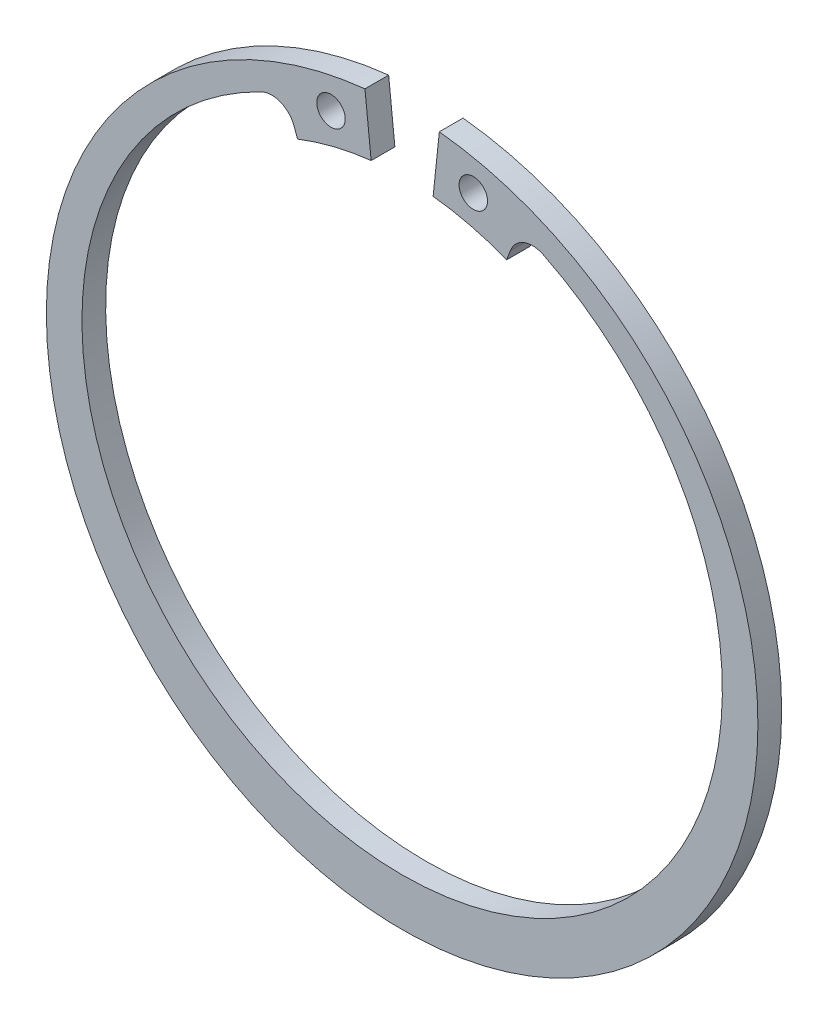
ISO-10303-21;
HEADER;
FILE_DESCRIPTION(('STEP AP214'),'2;1');
FILE_NAME('part.step','',(''),(''),'','','');
FILE_SCHEMA(('AUTOMOTIVE_DESIGN { 1 0 10303 214 1 1 1 1 }'));
ENDSEC;
DATA;
#1=APPLICATION_CONTEXT('core data for automotive mechanical design processes');
#2=APPLICATION_PROTOCOL_DEFINITION('international standard','automotive_design',2000,#1);
#3=PRODUCT_CONTEXT('',#1,'mechanical');
#4=PRODUCT('Part','Part','',(#3));
#5=PRODUCT_RELATED_PRODUCT_CATEGORY('part','',(#4));
#6=PRODUCT_DEFINITION_FORMATION('','',#4);
#7=PRODUCT_DEFINITION_CONTEXT('part definition',#1,'design');
#8=PRODUCT_DEFINITION('design','',#6,#7);
#9=PRODUCT_DEFINITION_SHAPE('','',#8);
#10=(LENGTH_UNIT() NAMED_UNIT(*) SI_UNIT(.MILLI.,.METRE.));
#11=(NAMED_UNIT(*) PLANE_ANGLE_UNIT() SI_UNIT($,.RADIAN.));
#12=(NAMED_UNIT(*) SI_UNIT($,.STERADIAN.) SOLID_ANGLE_UNIT());
#13=UNCERTAINTY_MEASURE_WITH_UNIT(LENGTH_MEASURE(1.E-05),#10,'distance_accuracy_value','');
#14=(GEOMETRIC_REPRESENTATION_CONTEXT(3) GLOBAL_UNCERTAINTY_ASSIGNED_CONTEXT((#13)) GLOBAL_UNIT_ASSIGNED_CONTEXT((#10,
#11,#12)) REPRESENTATION_CONTEXT('',''));
#15=CARTESIAN_POINT('',(0.,0.,0.));
#16=DIRECTION('',(0.,0.,1.));
#17=DIRECTION('',(1.,0.,0.));
#18=AXIS2_PLACEMENT_3D('',#15,#16,#17);
#19=CARTESIAN_POINT('',(-5.5,11.7249721603218,1.));
#20=DIRECTION('',(0.,0.,-1.));
#21=DIRECTION('',(-1.,0.,0.));
#22=AXIS2_PLACEMENT_3D('',#19,#20,#21);
#23=PLANE('',#22);
#24=CARTESIAN_POINT('',(-3.,13.4,1.));
#25=DIRECTION('',(0.,0.,1.));
#26=DIRECTION('',(1.,0.,0.));
#27=AXIS2_PLACEMENT_3D('',#24,#25,#26);
#28=CIRCLE('',#27,0.6);
#29=CARTESIAN_POINT('',(-2.4,13.4,1.));
#30=VERTEX_POINT('',#29);
#31=EDGE_CURVE('E444',#30,#30,#28,.T.);
#32=ORIENTED_EDGE('',*,*,#31,.F.);
#33=EDGE_LOOP('',(#32));
#34=FACE_BOUND('',#33,.T.);
#35=CARTESIAN_POINT('',(-5.5,11.7249721603218,1.));
#36=DIRECTION('',(0.,0.,-1.));
#37=DIRECTION('',(-1.,0.,0.));
#38=AXIS2_PLACEMENT_3D('',#35,#36,#37);
#39=CIRCLE('',#38,0.999999999999999);
#40=CARTESIAN_POINT('',(-5.94,12.6229699331476,1.));
#41=VERTEX_POINT('',#40);
#42=CARTESIAN_POINT('',(-4.56456854780298,12.0784802906959,1.));
#43=VERTEX_POINT('',#42);
#44=EDGE_CURVE('E466',#41,#43,#39,.T.);
#45=ORIENTED_EDGE('',*,*,#44,.T.);
#46=DIRECTION('',(0.353508130374086,-0.935431452197016,0.));
#47=VECTOR('',#46,1.);
#48=CARTESIAN_POINT('',(-4.40697867220381,11.6614756633136,1.));
#49=LINE('',#48,#47);
#50=CARTESIAN_POINT('',(-4.40697867220381,11.6614756633136,1.));
#51=VERTEX_POINT('',#50);
#52=EDGE_CURVE('E439',#43,#51,#49,.T.);
#53=ORIENTED_EDGE('',*,*,#52,.T.);
#54=CARTESIAN_POINT('',(0.,0.5,1.));
#55=DIRECTION('',(0.,0.,-1.));
#56=DIRECTION('',(1.,0.,0.));
#57=AXIS2_PLACEMENT_3D('',#54,#55,#56);
#58=CIRCLE('',#57,12.);
#59=CARTESIAN_POINT('',(-1.30630758499678,12.4286864529746,1.));
#60=VERTEX_POINT('',#59);
#61=EDGE_CURVE('E469',#51,#60,#58,.T.);
#62=ORIENTED_EDGE('',*,*,#61,.T.);
#63=DIRECTION('',(-0.104528463267654,0.994521895368273,0.));
#64=VECTOR('',#63,1.);
#65=CARTESIAN_POINT('',(-1.30630758499678,12.4286864529746,1.));
#66=LINE('',#65,#64);
#67=CARTESIAN_POINT('',(-1.56792694901482,14.9178284305241,1.));
#68=VERTEX_POINT('',#67);
#69=EDGE_CURVE('E471',#60,#68,#66,.T.);
#70=ORIENTED_EDGE('',*,*,#69,.T.);
#71=CARTESIAN_POINT('',(0.,0.,1.));
#72=DIRECTION('',(0.,0.,1.));
#73=DIRECTION('',(1.,0.,0.));
#74=AXIS2_PLACEMENT_3D('',#71,#72,#73);
#75=CIRCLE('',#74,15.);
#76=CARTESIAN_POINT('',(1.56792694901482,14.9178284305241,1.));
#77=VERTEX_POINT('',#76);
#78=EDGE_CURVE('E473',#68,#77,#75,.T.);
#79=ORIENTED_EDGE('',*,*,#78,.T.);
#80=DIRECTION('',(-0.104528463267654,-0.994521895368273,0.));
#81=VECTOR('',#80,1.);
#82=CARTESIAN_POINT('',(1.30630758499678,12.4286864529746,1.));
#83=LINE('',#82,#81);
#84=CARTESIAN_POINT('',(1.30630758499678,12.4286864529746,1.));
#85=VERTEX_POINT('',#84);
#86=EDGE_CURVE('E475',#77,#85,#83,.T.);
#87=ORIENTED_EDGE('',*,*,#86,.T.);
#88=CARTESIAN_POINT('',(0.,0.5,1.));
#89=DIRECTION('',(0.,0.,-1.));
#90=DIRECTION('',(-1.,0.,0.));
#91=AXIS2_PLACEMENT_3D('',#88,#89,#90);
#92=CIRCLE('',#91,12.);
#93=CARTESIAN_POINT('',(4.40697867220381,11.6614756633136,1.));
#94=VERTEX_POINT('',#93);
#95=EDGE_CURVE('E477',#85,#94,#92,.T.);
#96=ORIENTED_EDGE('',*,*,#95,.T.);
#97=DIRECTION('',(0.353508130374086,0.935431452197016,0.));
#98=VECTOR('',#97,1.);
#99=CARTESIAN_POINT('',(4.40697867220381,11.6614756633136,1.));
#100=LINE('',#99,#98);
#101=CARTESIAN_POINT('',(4.56456854780298,12.0784802906959,1.));
#102=VERTEX_POINT('',#101);
#103=EDGE_CURVE('E479',#94,#102,#100,.T.);
#104=ORIENTED_EDGE('',*,*,#103,.T.);
#105=CARTESIAN_POINT('',(5.5,11.7249721603218,1.));
#106=DIRECTION('',(0.,0.,-1.));
#107=DIRECTION('',(1.,0.,0.));
#108=AXIS2_PLACEMENT_3D('',#105,#106,#107);
#109=CIRCLE('',#108,1.);
#110=CARTESIAN_POINT('',(5.93999999999999,12.6229699331476,1.));
#111=VERTEX_POINT('',#110);
#112=EDGE_CURVE('E368',#102,#111,#109,.T.);
#113=ORIENTED_EDGE('',*,*,#112,.T.);
#114=CARTESIAN_POINT('',(0.,0.5,1.));
#115=DIRECTION('',(0.,0.,-1.));
#116=DIRECTION('',(1.,0.,0.));
#117=AXIS2_PLACEMENT_3D('',#114,#115,#116);
#118=CIRCLE('',#117,13.5);
#119=EDGE_CURVE('E363',#111,#41,#118,.T.);
#120=ORIENTED_EDGE('',*,*,#119,.T.);
#121=EDGE_LOOP('',(#45,#53,#62,#70,#79,#87,#96,#104,#113,#120));
#122=FACE_BOUND('',#121,.T.);
#123=CARTESIAN_POINT('',(3.,13.4,1.));
#124=DIRECTION('',(0.,0.,1.));
#125=DIRECTION('',(-1.,0.,0.));
#126=AXIS2_PLACEMENT_3D('',#123,#124,#125);
#127=CIRCLE('',#126,0.6);
#128=CARTESIAN_POINT('',(2.4,13.4,1.));
#129=VERTEX_POINT('',#128);
#130=EDGE_CURVE('E566',#129,#129,#127,.T.);
#131=ORIENTED_EDGE('',*,*,#130,.F.);
#132=EDGE_LOOP('',(#131));
#133=FACE_BOUND('',#132,.T.);
#134=ADVANCED_FACE('F348',(#34,#122,#133),#23,.F.);
#135=CARTESIAN_POINT('',(-5.5,11.7249721603218,0.));
#136=DIRECTION('',(0.,0.,-1.));
#137=DIRECTION('',(-1.,0.,0.));
#138=AXIS2_PLACEMENT_3D('',#135,#136,#137);
#139=PLANE('',#138);
#140=CARTESIAN_POINT('',(-3.,13.4,0.));
#141=DIRECTION('',(0.,0.,1.));
#142=DIRECTION('',(1.,0.,0.));
#143=AXIS2_PLACEMENT_3D('',#140,#141,#142);
#144=CIRCLE('',#143,0.6);
#145=CARTESIAN_POINT('',(-2.4,13.4,0.));
#146=VERTEX_POINT('',#145);
#147=EDGE_CURVE('E447',#146,#146,#144,.T.);
#148=ORIENTED_EDGE('',*,*,#147,.T.);
#149=EDGE_LOOP('',(#148));
#150=FACE_BOUND('',#149,.T.);
#151=CARTESIAN_POINT('',(-5.5,11.7249721603218,0.));
#152=DIRECTION('',(0.,0.,-1.));
#153=DIRECTION('',(-1.,0.,0.));
#154=AXIS2_PLACEMENT_3D('',#151,#152,#153);
#155=CIRCLE('',#154,0.999999999999999);
#156=CARTESIAN_POINT('',(-5.94,12.6229699331476,0.));
#157=VERTEX_POINT('',#156);
#158=CARTESIAN_POINT('',(-4.56456854780298,12.0784802906959,0.));
#159=VERTEX_POINT('',#158);
#160=EDGE_CURVE('E430',#157,#159,#155,.T.);
#161=ORIENTED_EDGE('',*,*,#160,.F.);
#162=CARTESIAN_POINT('',(0.,0.5,0.));
#163=DIRECTION('',(0.,0.,-1.));
#164=DIRECTION('',(1.,0.,0.));
#165=AXIS2_PLACEMENT_3D('',#162,#163,#164);
#166=CIRCLE('',#165,13.5);
#167=CARTESIAN_POINT('',(5.93999999999999,12.6229699331476,0.));
#168=VERTEX_POINT('',#167);
#169=EDGE_CURVE('E464',#168,#157,#166,.T.);
#170=ORIENTED_EDGE('',*,*,#169,.F.);
#171=CARTESIAN_POINT('',(5.5,11.7249721603218,0.));
#172=DIRECTION('',(0.,0.,-1.));
#173=DIRECTION('',(1.,0.,0.));
#174=AXIS2_PLACEMENT_3D('',#171,#172,#173);
#175=CIRCLE('',#174,1.);
#176=CARTESIAN_POINT('',(4.56456854780298,12.0784802906959,0.));
#177=VERTEX_POINT('',#176);
#178=EDGE_CURVE('E462',#177,#168,#175,.T.);
#179=ORIENTED_EDGE('',*,*,#178,.F.);
#180=DIRECTION('',(0.353508130374086,0.935431452197016,0.));
#181=VECTOR('',#180,1.);
#182=CARTESIAN_POINT('',(4.40697867220381,11.6614756633136,0.));
#183=LINE('',#182,#181);
#184=CARTESIAN_POINT('',(4.40697867220381,11.6614756633136,0.));
#185=VERTEX_POINT('',#184);
#186=EDGE_CURVE('E460',#185,#177,#183,.T.);
#187=ORIENTED_EDGE('',*,*,#186,.F.);
#188=CARTESIAN_POINT('',(0.,0.5,0.));
#189=DIRECTION('',(0.,0.,-1.));
#190=DIRECTION('',(-1.,0.,0.));
#191=AXIS2_PLACEMENT_3D('',#188,#189,#190);
#192=CIRCLE('',#191,12.);
#193=CARTESIAN_POINT('',(1.30630758499678,12.4286864529746,0.));
#194=VERTEX_POINT('',#193);
#195=EDGE_CURVE('E458',#194,#185,#192,.T.);
#196=ORIENTED_EDGE('',*,*,#195,.F.);
#197=DIRECTION('',(-0.104528463267654,-0.994521895368273,0.));
#198=VECTOR('',#197,1.);
#199=CARTESIAN_POINT('',(1.30630758499678,12.4286864529746,0.));
#200=LINE('',#199,#198);
#201=CARTESIAN_POINT('',(1.56792694901482,14.9178284305241,0.));
#202=VERTEX_POINT('',#201);
#203=EDGE_CURVE('E456',#202,#194,#200,.T.);
#204=ORIENTED_EDGE('',*,*,#203,.F.);
#205=CARTESIAN_POINT('',(0.,0.,0.));
#206=DIRECTION('',(0.,0.,1.));
#207=DIRECTION('',(1.,0.,0.));
#208=AXIS2_PLACEMENT_3D('',#205,#206,#207);
#209=CIRCLE('',#208,15.);
#210=CARTESIAN_POINT('',(-1.56792694901482,14.9178284305241,0.));
#211=VERTEX_POINT('',#210);
#212=EDGE_CURVE('E454',#211,#202,#209,.T.);
#213=ORIENTED_EDGE('',*,*,#212,.F.);
#214=DIRECTION('',(-0.104528463267654,0.994521895368273,0.));
#215=VECTOR('',#214,1.);
#216=CARTESIAN_POINT('',(-1.30630758499678,12.4286864529746,0.));
#217=LINE('',#216,#215);
#218=CARTESIAN_POINT('',(-1.30630758499678,12.4286864529746,0.));
#219=VERTEX_POINT('',#218);
#220=EDGE_CURVE('E452',#219,#211,#217,.T.);
#221=ORIENTED_EDGE('',*,*,#220,.F.);
#222=CARTESIAN_POINT('',(0.,0.5,0.));
#223=DIRECTION('',(0.,0.,-1.));
#224=DIRECTION('',(1.,0.,0.));
#225=AXIS2_PLACEMENT_3D('',#222,#223,#224);
#226=CIRCLE('',#225,12.);
#227=CARTESIAN_POINT('',(-4.40697867220381,11.6614756633136,0.));
#228=VERTEX_POINT('',#227);
#229=EDGE_CURVE('E432',#228,#219,#226,.T.);
#230=ORIENTED_EDGE('',*,*,#229,.F.);
#231=DIRECTION('',(0.353508130374086,-0.935431452197016,0.));
#232=VECTOR('',#231,1.);
#233=CARTESIAN_POINT('',(-4.40697867220381,11.6614756633136,0.));
#234=LINE('',#233,#232);
#235=EDGE_CURVE('E425',#159,#228,#234,.T.);
#236=ORIENTED_EDGE('',*,*,#235,.F.);
#237=EDGE_LOOP('',(#161,#170,#179,#187,#196,#204,#213,#221,#230,#236));
#238=FACE_BOUND('',#237,.T.);
#239=CARTESIAN_POINT('',(3.,13.4,0.));
#240=DIRECTION('',(0.,0.,1.));
#241=DIRECTION('',(-1.,0.,0.));
#242=AXIS2_PLACEMENT_3D('',#239,#240,#241);
#243=CIRCLE('',#242,0.6);
#244=CARTESIAN_POINT('',(2.4,13.4,0.));
#245=VERTEX_POINT('',#244);
#246=EDGE_CURVE('E569',#245,#245,#243,.T.);
#247=ORIENTED_EDGE('',*,*,#246,.T.);
#248=EDGE_LOOP('',(#247));
#249=FACE_BOUND('',#248,.T.);
#250=ADVANCED_FACE('F426',(#150,#238,#249),#139,.T.);
#251=CARTESIAN_POINT('',(-5.5,11.7249721603218,1.));
#252=DIRECTION('',(0.,0.,-1.));
#253=DIRECTION('',(-1.,0.,0.));
#254=AXIS2_PLACEMENT_3D('',#251,#252,#253);
#255=CYLINDRICAL_SURFACE('',#254,0.999999999999999);
#256=ORIENTED_EDGE('',*,*,#160,.T.);
#257=DIRECTION('',(0.,0.,-1.));
#258=VECTOR('',#257,1.);
#259=CARTESIAN_POINT('',(-4.56456854780298,12.0784802906959,1.));
#260=LINE('',#259,#258);
#261=EDGE_CURVE('E11',#43,#159,#260,.T.);
#262=ORIENTED_EDGE('',*,*,#261,.F.);
#263=ORIENTED_EDGE('',*,*,#44,.F.);
#264=DIRECTION('',(0.,0.,-1.));
#265=VECTOR('',#264,1.);
#266=CARTESIAN_POINT('',(-5.94,12.6229699331476,1.));
#267=LINE('',#266,#265);
#268=EDGE_CURVE('E443',#41,#157,#267,.T.);
#269=ORIENTED_EDGE('',*,*,#268,.T.);
#270=EDGE_LOOP('',(#256,#262,#263,#269));
#271=FACE_BOUND('',#270,.T.);
#272=ADVANCED_FACE('F350',(#271),#255,.F.);
#273=CARTESIAN_POINT('',(-4.40697867220381,11.6614756633136,1.));
#274=DIRECTION('',(0.935431452197016,0.353508130374086,0.));
#275=DIRECTION('',(-0.353508130374086,0.935431452197016,0.));
#276=AXIS2_PLACEMENT_3D('',#273,#274,#275);
#277=PLANE('',#276);
#278=ORIENTED_EDGE('',*,*,#235,.T.);
#279=DIRECTION('',(0.,0.,-1.));
#280=VECTOR('',#279,1.);
#281=CARTESIAN_POINT('',(-4.40697867220381,11.6614756633136,1.));
#282=LINE('',#281,#280);
#283=EDGE_CURVE('E356',#51,#228,#282,.T.);
#284=ORIENTED_EDGE('',*,*,#283,.F.);
#285=ORIENTED_EDGE('',*,*,#52,.F.);
#286=ORIENTED_EDGE('',*,*,#261,.T.);
#287=EDGE_LOOP('',(#278,#284,#285,#286));
#288=FACE_BOUND('',#287,.T.);
#289=ADVANCED_FACE('F438',(#288),#277,.F.);
#290=CARTESIAN_POINT('',(0.,0.5,1.));
#291=DIRECTION('',(0.,0.,-1.));
#292=DIRECTION('',(-1.,0.,0.));
#293=AXIS2_PLACEMENT_3D('',#290,#291,#292);
#294=CYLINDRICAL_SURFACE('',#293,12.);
#295=ORIENTED_EDGE('',*,*,#229,.T.);
#296=DIRECTION('',(0.,0.,-1.));
#297=VECTOR('',#296,1.);
#298=CARTESIAN_POINT('',(-1.30630758499678,12.4286864529746,1.));
#299=LINE('',#298,#297);
#300=EDGE_CURVE('E502',#60,#219,#299,.T.);
#301=ORIENTED_EDGE('',*,*,#300,.F.);
#302=ORIENTED_EDGE('',*,*,#61,.F.);
#303=ORIENTED_EDGE('',*,*,#283,.T.);
#304=EDGE_LOOP('',(#295,#301,#302,#303));
#305=FACE_BOUND('',#304,.T.);
#306=ADVANCED_FACE('F506',(#305),#294,.F.);
#307=CARTESIAN_POINT('',(-1.30630758499678,12.4286864529746,1.));
#308=DIRECTION('',(-0.994521895368273,-0.104528463267654,0.));
#309=DIRECTION('',(0.104528463267654,-0.994521895368273,0.));
#310=AXIS2_PLACEMENT_3D('',#307,#308,#309);
#311=PLANE('',#310);
#312=ORIENTED_EDGE('',*,*,#220,.T.);
#313=DIRECTION('',(0.,0.,-1.));
#314=VECTOR('',#313,1.);
#315=CARTESIAN_POINT('',(-1.56792694901482,14.9178284305241,1.));
#316=LINE('',#315,#314);
#317=EDGE_CURVE('E499',#68,#211,#316,.T.);
#318=ORIENTED_EDGE('',*,*,#317,.F.);
#319=ORIENTED_EDGE('',*,*,#69,.F.);
#320=ORIENTED_EDGE('',*,*,#300,.T.);
#321=EDGE_LOOP('',(#312,#318,#319,#320));
#322=FACE_BOUND('',#321,.T.);
#323=ADVANCED_FACE('F514',(#322),#311,.F.);
#324=CARTESIAN_POINT('',(0.,0.,1.));
#325=DIRECTION('',(0.,0.,-1.));
#326=DIRECTION('',(-1.,0.,0.));
#327=AXIS2_PLACEMENT_3D('',#324,#325,#326);
#328=CYLINDRICAL_SURFACE('',#327,15.);
#329=ORIENTED_EDGE('',*,*,#212,.T.);
#330=DIRECTION('',(0.,0.,-1.));
#331=VECTOR('',#330,1.);
#332=CARTESIAN_POINT('',(1.56792694901482,14.9178284305241,1.));
#333=LINE('',#332,#331);
#334=EDGE_CURVE('E496',#77,#202,#333,.T.);
#335=ORIENTED_EDGE('',*,*,#334,.F.);
#336=ORIENTED_EDGE('',*,*,#78,.F.);
#337=ORIENTED_EDGE('',*,*,#317,.T.);
#338=EDGE_LOOP('',(#329,#335,#336,#337));
#339=FACE_BOUND('',#338,.T.);
#340=ADVANCED_FACE('F517',(#339),#328,.T.);
#341=CARTESIAN_POINT('',(1.30630758499678,12.4286864529746,1.));
#342=DIRECTION('',(0.994521895368273,-0.104528463267654,0.));
#343=DIRECTION('',(0.104528463267654,0.994521895368273,0.));
#344=AXIS2_PLACEMENT_3D('',#341,#342,#343);
#345=PLANE('',#344);
#346=ORIENTED_EDGE('',*,*,#203,.T.);
#347=DIRECTION('',(0.,0.,-1.));
#348=VECTOR('',#347,1.);
#349=CARTESIAN_POINT('',(1.30630758499678,12.4286864529746,1.));
#350=LINE('',#349,#348);
#351=EDGE_CURVE('E493',#85,#194,#350,.T.);
#352=ORIENTED_EDGE('',*,*,#351,.F.);
#353=ORIENTED_EDGE('',*,*,#86,.F.);
#354=ORIENTED_EDGE('',*,*,#334,.T.);
#355=EDGE_LOOP('',(#346,#352,#353,#354));
#356=FACE_BOUND('',#355,.T.);
#357=ADVANCED_FACE('F522',(#356),#345,.F.);
#358=CARTESIAN_POINT('',(0.,0.5,1.));
#359=DIRECTION('',(0.,0.,-1.));
#360=DIRECTION('',(-1.,0.,0.));
#361=AXIS2_PLACEMENT_3D('',#358,#359,#360);
#362=CYLINDRICAL_SURFACE('',#361,12.);
#363=ORIENTED_EDGE('',*,*,#195,.T.);
#364=DIRECTION('',(0.,0.,-1.));
#365=VECTOR('',#364,1.);
#366=CARTESIAN_POINT('',(4.40697867220381,11.6614756633136,1.));
#367=LINE('',#366,#365);
#368=EDGE_CURVE('E490',#94,#185,#367,.T.);
#369=ORIENTED_EDGE('',*,*,#368,.F.);
#370=ORIENTED_EDGE('',*,*,#95,.F.);
#371=ORIENTED_EDGE('',*,*,#351,.T.);
#372=EDGE_LOOP('',(#363,#369,#370,#371));
#373=FACE_BOUND('',#372,.T.);
#374=ADVANCED_FACE('F528',(#373),#362,.F.);
#375=CARTESIAN_POINT('',(4.40697867220381,11.6614756633136,1.));
#376=DIRECTION('',(-0.935431452197016,0.353508130374086,0.));
#377=DIRECTION('',(-0.353508130374086,-0.935431452197016,0.));
#378=AXIS2_PLACEMENT_3D('',#375,#376,#377);
#379=PLANE('',#378);
#380=ORIENTED_EDGE('',*,*,#186,.T.);
#381=DIRECTION('',(0.,0.,-1.));
#382=VECTOR('',#381,1.);
#383=CARTESIAN_POINT('',(4.56456854780298,12.0784802906959,1.));
#384=LINE('',#383,#382);
#385=EDGE_CURVE('E487',#102,#177,#384,.T.);
#386=ORIENTED_EDGE('',*,*,#385,.F.);
#387=ORIENTED_EDGE('',*,*,#103,.F.);
#388=ORIENTED_EDGE('',*,*,#368,.T.);
#389=EDGE_LOOP('',(#380,#386,#387,#388));
#390=FACE_BOUND('',#389,.T.);
#391=ADVANCED_FACE('F532',(#390),#379,.F.);
#392=CARTESIAN_POINT('',(5.5,11.7249721603218,1.));
#393=DIRECTION('',(0.,0.,-1.));
#394=DIRECTION('',(-1.,0.,0.));
#395=AXIS2_PLACEMENT_3D('',#392,#393,#394);
#396=CYLINDRICAL_SURFACE('',#395,1.);
#397=ORIENTED_EDGE('',*,*,#178,.T.);
#398=DIRECTION('',(0.,0.,-1.));
#399=VECTOR('',#398,1.);
#400=CARTESIAN_POINT('',(5.93999999999999,12.6229699331476,1.));
#401=LINE('',#400,#399);
#402=EDGE_CURVE('E484',#111,#168,#401,.T.);
#403=ORIENTED_EDGE('',*,*,#402,.F.);
#404=ORIENTED_EDGE('',*,*,#112,.F.);
#405=ORIENTED_EDGE('',*,*,#385,.T.);
#406=EDGE_LOOP('',(#397,#403,#404,#405));
#407=FACE_BOUND('',#406,.T.);
#408=ADVANCED_FACE('F535',(#407),#396,.F.);
#409=CARTESIAN_POINT('',(0.,0.5,1.));
#410=DIRECTION('',(0.,0.,-1.));
#411=DIRECTION('',(-1.,0.,0.));
#412=AXIS2_PLACEMENT_3D('',#409,#410,#411);
#413=CYLINDRICAL_SURFACE('',#412,13.5);
#414=ORIENTED_EDGE('',*,*,#169,.T.);
#415=ORIENTED_EDGE('',*,*,#268,.F.);
#416=ORIENTED_EDGE('',*,*,#119,.F.);
#417=ORIENTED_EDGE('',*,*,#402,.T.);
#418=EDGE_LOOP('',(#414,#415,#416,#417));
#419=FACE_BOUND('',#418,.T.);
#420=ADVANCED_FACE('F537',(#419),#413,.F.);
#421=CARTESIAN_POINT('',(-3.,13.4,1.));
#422=DIRECTION('',(0.,0.,-1.));
#423=DIRECTION('',(-1.,0.,0.));
#424=AXIS2_PLACEMENT_3D('',#421,#422,#423);
#425=CYLINDRICAL_SURFACE('',#424,0.6);
#426=ORIENTED_EDGE('',*,*,#31,.T.);
#427=EDGE_LOOP('',(#426));
#428=FACE_BOUND('',#427,.T.);
#429=ORIENTED_EDGE('',*,*,#147,.F.);
#430=EDGE_LOOP('',(#429));
#431=FACE_BOUND('',#430,.T.);
#432=ADVANCED_FACE('F539',(#428,#431),#425,.F.);
#433=CARTESIAN_POINT('',(3.,13.4,1.));
#434=DIRECTION('',(0.,0.,-1.));
#435=DIRECTION('',(-1.,0.,0.));
#436=AXIS2_PLACEMENT_3D('',#433,#434,#435);
#437=CYLINDRICAL_SURFACE('',#436,0.6);
#438=ORIENTED_EDGE('',*,*,#130,.T.);
#439=EDGE_LOOP('',(#438));
#440=FACE_BOUND('',#439,.T.);
#441=ORIENTED_EDGE('',*,*,#246,.F.);
#442=EDGE_LOOP('',(#441));
#443=FACE_BOUND('',#442,.T.);
#444=ADVANCED_FACE('F545',(#440,#443),#437,.F.);
#445=CLOSED_SHELL('',(#134,#250,#272,#289,#306,#323,#340,#357,#374,#391,#408,#420,#432,#444));
#446=MANIFOLD_SOLID_BREP('B2',#445);
#447=ADVANCED_BREP_SHAPE_REPRESENTATION('',(#18,#446),#14);
#448=SHAPE_DEFINITION_REPRESENTATION(#9,#447);
ENDSEC;
END-ISO-10303-21;
